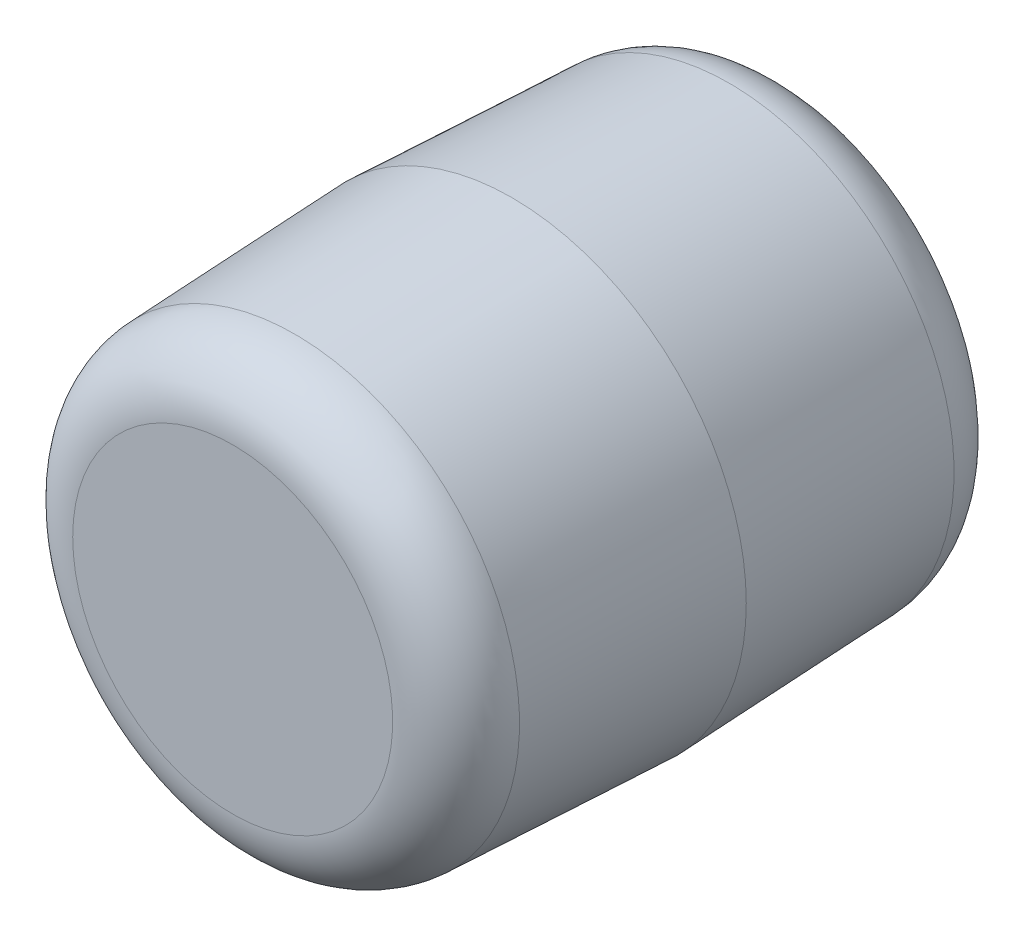
ISO-10303-21;
HEADER;
FILE_DESCRIPTION(('STEP AP214'),'2;1');
FILE_NAME('part.step','',(''),(''),'','','');
FILE_SCHEMA(('AUTOMOTIVE_DESIGN { 1 0 10303 214 1 1 1 1 }'));
ENDSEC;
DATA;
#1=APPLICATION_CONTEXT('core data for automotive mechanical design processes');
#2=APPLICATION_PROTOCOL_DEFINITION('international standard','automotive_design',2000,#1);
#3=PRODUCT_CONTEXT('',#1,'mechanical');
#4=PRODUCT('Part','Part','',(#3));
#5=PRODUCT_RELATED_PRODUCT_CATEGORY('part','',(#4));
#6=PRODUCT_DEFINITION_FORMATION('','',#4);
#7=PRODUCT_DEFINITION_CONTEXT('part definition',#1,'design');
#8=PRODUCT_DEFINITION('design','',#6,#7);
#9=PRODUCT_DEFINITION_SHAPE('','',#8);
#10=(LENGTH_UNIT() NAMED_UNIT(*) SI_UNIT(.MILLI.,.METRE.));
#11=(NAMED_UNIT(*) PLANE_ANGLE_UNIT() SI_UNIT($,.RADIAN.));
#12=(NAMED_UNIT(*) SI_UNIT($,.STERADIAN.) SOLID_ANGLE_UNIT());
#13=UNCERTAINTY_MEASURE_WITH_UNIT(LENGTH_MEASURE(1.E-05),#10,'distance_accuracy_value','');
#14=(GEOMETRIC_REPRESENTATION_CONTEXT(3) GLOBAL_UNCERTAINTY_ASSIGNED_CONTEXT((#13)) GLOBAL_UNIT_ASSIGNED_CONTEXT((#10,
#11,#12)) REPRESENTATION_CONTEXT('',''));
#15=CARTESIAN_POINT('',(0.,0.,0.));
#16=DIRECTION('',(0.,0.,1.));
#17=DIRECTION('',(1.,0.,0.));
#18=AXIS2_PLACEMENT_3D('',#15,#16,#17);
#19=CARTESIAN_POINT('',(0.,0.,189.75));
#20=DIRECTION('',(0.,0.,1.));
#21=DIRECTION('',(1.,0.,0.));
#22=AXIS2_PLACEMENT_3D('',#19,#20,#21);
#23=PLANE('',#22);
#24=CARTESIAN_POINT('',(0.,0.,189.75));
#25=DIRECTION('',(0.,0.,-1.));
#26=DIRECTION('',(-1.,0.,0.));
#27=AXIS2_PLACEMENT_3D('',#24,#25,#26);
#28=CIRCLE('',#27,110.962563910009);
#29=CARTESIAN_POINT('',(-110.962563910009,0.,189.75));
#30=VERTEX_POINT('',#29);
#31=EDGE_CURVE('E10',#30,#30,#28,.T.);
#32=ORIENTED_EDGE('',*,*,#31,.T.);
#33=EDGE_LOOP('',(#32));
#34=FACE_BOUND('',#33,.T.);
#35=ADVANCED_FACE('F35',(#34),#23,.F.);
#36=CARTESIAN_POINT('',(0.,0.,148.75));
#37=DIRECTION('',(0.,0.,-1.));
#38=DIRECTION('',(-1.,0.,0.));
#39=AXIS2_PLACEMENT_3D('',#36,#37,#38);
#40=TOROIDAL_SURFACE('',#39,110.962563910009,41.0000000000001);
#41=ORIENTED_EDGE('',*,*,#31,.F.);
#42=EDGE_LOOP('',(#41));
#43=FACE_BOUND('',#42,.T.);
#44=CARTESIAN_POINT('',(0.,0.,150.538394881979));
#45=DIRECTION('',(0.,0.,-1.));
#46=DIRECTION('',(-1.,0.,0.));
#47=AXIS2_PLACEMENT_3D('',#44,#45,#46);
#48=CIRCLE('',#47,151.923540994866);
#49=CARTESIAN_POINT('',(-151.923540994866,0.,150.538394881979));
#50=VERTEX_POINT('',#49);
#51=EDGE_CURVE('E41',#50,#50,#48,.T.);
#52=ORIENTED_EDGE('',*,*,#51,.T.);
#53=EDGE_LOOP('',(#52));
#54=FACE_BOUND('',#53,.T.);
#55=ADVANCED_FACE('F103',(#43,#54),#40,.F.);
#56=CARTESIAN_POINT('',(0.,0.,0.));
#57=DIRECTION('',(0.,0.,-1.));
#58=DIRECTION('',(-1.,0.,0.));
#59=AXIS2_PLACEMENT_3D('',#56,#57,#58);
#60=CONICAL_SURFACE('',#59,158.496189259347,0.0436332312998577);
#61=ORIENTED_EDGE('',*,*,#51,.F.);
#62=EDGE_LOOP('',(#61));
#63=FACE_BOUND('',#62,.T.);
#64=CARTESIAN_POINT('',(0.,0.,0.));
#65=DIRECTION('',(0.,0.,-1.));
#66=DIRECTION('',(-1.,0.,0.));
#67=AXIS2_PLACEMENT_3D('',#64,#65,#66);
#68=CIRCLE('',#67,158.496189259347);
#69=CARTESIAN_POINT('',(-158.496189259347,0.,0.));
#70=VERTEX_POINT('',#69);
#71=EDGE_CURVE('E45',#70,#70,#68,.T.);
#72=ORIENTED_EDGE('',*,*,#71,.T.);
#73=EDGE_LOOP('',(#72));
#74=FACE_BOUND('',#73,.T.);
#75=ADVANCED_FACE('F107',(#63,#74),#60,.F.);
#76=CARTESIAN_POINT('',(0.,0.,-150.538394881979));
#77=DIRECTION('',(0.,0.,1.));
#78=DIRECTION('',(1.,0.,0.));
#79=AXIS2_PLACEMENT_3D('',#76,#77,#78);
#80=CONICAL_SURFACE('',#79,151.923540994866,0.0436332312998544);
#81=ORIENTED_EDGE('',*,*,#71,.F.);
#82=EDGE_LOOP('',(#81));
#83=FACE_BOUND('',#82,.T.);
#84=CARTESIAN_POINT('',(0.,0.,-150.538394881979));
#85=DIRECTION('',(0.,0.,-1.));
#86=DIRECTION('',(-1.,0.,0.));
#87=AXIS2_PLACEMENT_3D('',#84,#85,#86);
#88=CIRCLE('',#87,151.923540994866);
#89=CARTESIAN_POINT('',(-151.923540994866,0.,-150.538394881979));
#90=VERTEX_POINT('',#89);
#91=EDGE_CURVE('E49',#90,#90,#88,.T.);
#92=ORIENTED_EDGE('',*,*,#91,.T.);
#93=EDGE_LOOP('',(#92));
#94=FACE_BOUND('',#93,.T.);
#95=ADVANCED_FACE('F112',(#83,#94),#80,.F.);
#96=CARTESIAN_POINT('',(0.,0.,-148.75));
#97=DIRECTION('',(0.,0.,-1.));
#98=DIRECTION('',(-1.,0.,0.));
#99=AXIS2_PLACEMENT_3D('',#96,#97,#98);
#100=TOROIDAL_SURFACE('',#99,110.96256391001,41.);
#101=ORIENTED_EDGE('',*,*,#91,.F.);
#102=EDGE_LOOP('',(#101));
#103=FACE_BOUND('',#102,.T.);
#104=CARTESIAN_POINT('',(0.,0.,-189.75));
#105=DIRECTION('',(0.,0.,-1.));
#106=DIRECTION('',(-1.,0.,0.));
#107=AXIS2_PLACEMENT_3D('',#104,#105,#106);
#108=CIRCLE('',#107,110.96256391001);
#109=CARTESIAN_POINT('',(-110.96256391001,0.,-189.75));
#110=VERTEX_POINT('',#109);
#111=EDGE_CURVE('E54',#110,#110,#108,.T.);
#112=ORIENTED_EDGE('',*,*,#111,.T.);
#113=EDGE_LOOP('',(#112));
#114=FACE_BOUND('',#113,.T.);
#115=ADVANCED_FACE('F118',(#103,#114),#100,.F.);
#116=CARTESIAN_POINT('',(110.96256391001,0.,-189.75));
#117=DIRECTION('',(0.,0.,-1.));
#118=DIRECTION('',(-1.,0.,0.));
#119=AXIS2_PLACEMENT_3D('',#116,#117,#118);
#120=PLANE('',#119);
#121=ORIENTED_EDGE('',*,*,#111,.F.);
#122=EDGE_LOOP('',(#121));
#123=FACE_BOUND('',#122,.T.);
#124=CARTESIAN_POINT('',(0.,0.,-189.75));
#125=DIRECTION('',(0.,0.,-1.));
#126=DIRECTION('',(-1.,0.,0.));
#127=AXIS2_PLACEMENT_3D('',#124,#125,#126);
#128=CIRCLE('',#127,37.);
#129=CARTESIAN_POINT('',(-37.,0.,-189.75));
#130=VERTEX_POINT('',#129);
#131=EDGE_CURVE('E57',#130,#130,#128,.T.);
#132=ORIENTED_EDGE('',*,*,#131,.T.);
#133=EDGE_LOOP('',(#132));
#134=FACE_BOUND('',#133,.T.);
#135=ADVANCED_FACE('F122',(#123,#134),#120,.F.);
#136=CARTESIAN_POINT('',(0.,0.,-205.75));
#137=DIRECTION('',(0.,0.,-1.));
#138=DIRECTION('',(-1.,0.,0.));
#139=AXIS2_PLACEMENT_3D('',#136,#137,#138);
#140=TOROIDAL_SURFACE('',#139,37.,16.);
#141=ORIENTED_EDGE('',*,*,#131,.F.);
#142=EDGE_LOOP('',(#141));
#143=FACE_BOUND('',#142,.T.);
#144=CARTESIAN_POINT('',(0.,0.,-205.75));
#145=DIRECTION('',(0.,0.,-1.));
#146=DIRECTION('',(-1.,0.,0.));
#147=AXIS2_PLACEMENT_3D('',#144,#145,#146);
#148=CIRCLE('',#147,21.);
#149=CARTESIAN_POINT('',(-21.,0.,-205.75));
#150=VERTEX_POINT('',#149);
#151=EDGE_CURVE('E60',#150,#150,#148,.T.);
#152=ORIENTED_EDGE('',*,*,#151,.T.);
#153=EDGE_LOOP('',(#152));
#154=FACE_BOUND('',#153,.T.);
#155=ADVANCED_FACE('F126',(#143,#154),#140,.T.);
#156=CARTESIAN_POINT('',(0.,0.,-288.058740367563));
#157=DIRECTION('',(0.,0.,-1.));
#158=DIRECTION('',(-1.,0.,0.));
#159=AXIS2_PLACEMENT_3D('',#156,#157,#158);
#160=CYLINDRICAL_SURFACE('',#159,21.);
#161=ORIENTED_EDGE('',*,*,#151,.F.);
#162=EDGE_LOOP('',(#161));
#163=FACE_BOUND('',#162,.T.);
#164=CARTESIAN_POINT('',(0.,0.,-213.75));
#165=DIRECTION('',(0.,0.,-1.));
#166=DIRECTION('',(-1.,0.,0.));
#167=AXIS2_PLACEMENT_3D('',#164,#165,#166);
#168=CIRCLE('',#167,21.);
#169=CARTESIAN_POINT('',(-21.,0.,-213.75));
#170=VERTEX_POINT('',#169);
#171=EDGE_CURVE('E63',#170,#170,#168,.T.);
#172=ORIENTED_EDGE('',*,*,#171,.T.);
#173=EDGE_LOOP('',(#172));
#174=FACE_BOUND('',#173,.T.);
#175=ADVANCED_FACE('F130',(#163,#174),#160,.F.);
#176=CARTESIAN_POINT('',(21.,0.,-213.75));
#177=DIRECTION('',(0.,0.,1.));
#178=DIRECTION('',(1.,0.,0.));
#179=AXIS2_PLACEMENT_3D('',#176,#177,#178);
#180=PLANE('',#179);
#181=ORIENTED_EDGE('',*,*,#171,.F.);
#182=EDGE_LOOP('',(#181));
#183=FACE_BOUND('',#182,.T.);
#184=CARTESIAN_POINT('',(0.,0.,-213.75));
#185=DIRECTION('',(0.,0.,-1.));
#186=DIRECTION('',(-1.,0.,0.));
#187=AXIS2_PLACEMENT_3D('',#184,#185,#186);
#188=CIRCLE('',#187,25.);
#189=CARTESIAN_POINT('',(-25.,0.,-213.75));
#190=VERTEX_POINT('',#189);
#191=EDGE_CURVE('E66',#190,#190,#188,.T.);
#192=ORIENTED_EDGE('',*,*,#191,.T.);
#193=EDGE_LOOP('',(#192));
#194=FACE_BOUND('',#193,.T.);
#195=ADVANCED_FACE('F134',(#183,#194),#180,.F.);
#196=CARTESIAN_POINT('',(0.,0.,-288.058740367563));
#197=DIRECTION('',(0.,0.,-1.));
#198=DIRECTION('',(-1.,0.,0.));
#199=AXIS2_PLACEMENT_3D('',#196,#197,#198);
#200=CYLINDRICAL_SURFACE('',#199,25.);
#201=ORIENTED_EDGE('',*,*,#191,.F.);
#202=EDGE_LOOP('',(#201));
#203=FACE_BOUND('',#202,.T.);
#204=CARTESIAN_POINT('',(0.,0.,-205.75));
#205=DIRECTION('',(0.,0.,-1.));
#206=DIRECTION('',(-1.,0.,0.));
#207=AXIS2_PLACEMENT_3D('',#204,#205,#206);
#208=CIRCLE('',#207,25.);
#209=CARTESIAN_POINT('',(-25.,0.,-205.75));
#210=VERTEX_POINT('',#209);
#211=EDGE_CURVE('E69',#210,#210,#208,.T.);
#212=ORIENTED_EDGE('',*,*,#211,.T.);
#213=EDGE_LOOP('',(#212));
#214=FACE_BOUND('',#213,.T.);
#215=ADVANCED_FACE('F138',(#203,#214),#200,.T.);
#216=CARTESIAN_POINT('',(0.,0.,-205.75));
#217=DIRECTION('',(0.,0.,-1.));
#218=DIRECTION('',(-1.,0.,0.));
#219=AXIS2_PLACEMENT_3D('',#216,#217,#218);
#220=TOROIDAL_SURFACE('',#219,37.,12.);
#221=ORIENTED_EDGE('',*,*,#211,.F.);
#222=EDGE_LOOP('',(#221));
#223=FACE_BOUND('',#222,.T.);
#224=CARTESIAN_POINT('',(0.,0.,-193.75));
#225=DIRECTION('',(0.,0.,-1.));
#226=DIRECTION('',(-1.,0.,0.));
#227=AXIS2_PLACEMENT_3D('',#224,#225,#226);
#228=CIRCLE('',#227,37.0000000000001);
#229=CARTESIAN_POINT('',(-37.0000000000001,0.,-193.75));
#230=VERTEX_POINT('',#229);
#231=EDGE_CURVE('E72',#230,#230,#228,.T.);
#232=ORIENTED_EDGE('',*,*,#231,.T.);
#233=EDGE_LOOP('',(#232));
#234=FACE_BOUND('',#233,.T.);
#235=ADVANCED_FACE('F142',(#223,#234),#220,.F.);
#236=CARTESIAN_POINT('',(110.96256391001,0.,-193.75));
#237=DIRECTION('',(0.,0.,1.));
#238=DIRECTION('',(1.,0.,0.));
#239=AXIS2_PLACEMENT_3D('',#236,#237,#238);
#240=PLANE('',#239);
#241=ORIENTED_EDGE('',*,*,#231,.F.);
#242=EDGE_LOOP('',(#241));
#243=FACE_BOUND('',#242,.T.);
#244=CARTESIAN_POINT('',(0.,0.,-193.75));
#245=DIRECTION('',(0.,0.,-1.));
#246=DIRECTION('',(-1.,0.,0.));
#247=AXIS2_PLACEMENT_3D('',#244,#245,#246);
#248=CIRCLE('',#247,110.96256391001);
#249=CARTESIAN_POINT('',(-110.96256391001,0.,-193.75));
#250=VERTEX_POINT('',#249);
#251=EDGE_CURVE('E75',#250,#250,#248,.T.);
#252=ORIENTED_EDGE('',*,*,#251,.T.);
#253=EDGE_LOOP('',(#252));
#254=FACE_BOUND('',#253,.T.);
#255=ADVANCED_FACE('F146',(#243,#254),#240,.F.);
#256=CARTESIAN_POINT('',(0.,0.,-148.75));
#257=DIRECTION('',(0.,0.,-1.));
#258=DIRECTION('',(-1.,0.,0.));
#259=AXIS2_PLACEMENT_3D('',#256,#257,#258);
#260=TOROIDAL_SURFACE('',#259,110.96256391001,45.);
#261=ORIENTED_EDGE('',*,*,#251,.F.);
#262=EDGE_LOOP('',(#261));
#263=FACE_BOUND('',#262,.T.);
#264=CARTESIAN_POINT('',(0.,0.,-150.71287243144));
#265=DIRECTION('',(0.,0.,-1.));
#266=DIRECTION('',(-1.,0.,0.));
#267=AXIS2_PLACEMENT_3D('',#264,#265,#266);
#268=CIRCLE('',#267,155.919733881194);
#269=CARTESIAN_POINT('',(-155.919733881194,0.,-150.71287243144));
#270=VERTEX_POINT('',#269);
#271=EDGE_CURVE('E78',#270,#270,#268,.T.);
#272=ORIENTED_EDGE('',*,*,#271,.T.);
#273=EDGE_LOOP('',(#272));
#274=FACE_BOUND('',#273,.T.);
#275=ADVANCED_FACE('F150',(#263,#274),#260,.T.);
#276=CARTESIAN_POINT('',(0.,0.,0.));
#277=DIRECTION('',(0.,0.,1.));
#278=DIRECTION('',(1.,0.,0.));
#279=AXIS2_PLACEMENT_3D('',#276,#277,#278);
#280=CONICAL_SURFACE('',#279,162.5,0.0436332312998544);
#281=ORIENTED_EDGE('',*,*,#271,.F.);
#282=EDGE_LOOP('',(#281));
#283=FACE_BOUND('',#282,.T.);
#284=CARTESIAN_POINT('',(0.,0.,0.));
#285=DIRECTION('',(0.,0.,-1.));
#286=DIRECTION('',(-1.,0.,0.));
#287=AXIS2_PLACEMENT_3D('',#284,#285,#286);
#288=CIRCLE('',#287,162.5);
#289=CARTESIAN_POINT('',(-162.5,0.,0.));
#290=VERTEX_POINT('',#289);
#291=EDGE_CURVE('E81',#290,#290,#288,.T.);
#292=ORIENTED_EDGE('',*,*,#291,.T.);
#293=EDGE_LOOP('',(#292));
#294=FACE_BOUND('',#293,.T.);
#295=ADVANCED_FACE('F154',(#283,#294),#280,.T.);
#296=CARTESIAN_POINT('',(0.,0.,150.71287243144));
#297=DIRECTION('',(0.,0.,-1.));
#298=DIRECTION('',(-1.,0.,0.));
#299=AXIS2_PLACEMENT_3D('',#296,#297,#298);
#300=CONICAL_SURFACE('',#299,155.919733881193,0.0436332312998577);
#301=ORIENTED_EDGE('',*,*,#291,.F.);
#302=EDGE_LOOP('',(#301));
#303=FACE_BOUND('',#302,.T.);
#304=CARTESIAN_POINT('',(0.,0.,150.71287243144));
#305=DIRECTION('',(0.,0.,-1.));
#306=DIRECTION('',(-1.,0.,0.));
#307=AXIS2_PLACEMENT_3D('',#304,#305,#306);
#308=CIRCLE('',#307,155.919733881193);
#309=CARTESIAN_POINT('',(-155.919733881193,0.,150.71287243144));
#310=VERTEX_POINT('',#309);
#311=EDGE_CURVE('E84',#310,#310,#308,.T.);
#312=ORIENTED_EDGE('',*,*,#311,.T.);
#313=EDGE_LOOP('',(#312));
#314=FACE_BOUND('',#313,.T.);
#315=ADVANCED_FACE('F99',(#303,#314),#300,.T.);
#316=CARTESIAN_POINT('',(0.,0.,148.75));
#317=DIRECTION('',(0.,0.,-1.));
#318=DIRECTION('',(-1.,0.,0.));
#319=AXIS2_PLACEMENT_3D('',#316,#317,#318);
#320=TOROIDAL_SURFACE('',#319,110.962563910009,45.);
#321=ORIENTED_EDGE('',*,*,#311,.F.);
#322=EDGE_LOOP('',(#321));
#323=FACE_BOUND('',#322,.T.);
#324=CARTESIAN_POINT('',(0.,0.,193.75));
#325=DIRECTION('',(0.,0.,-1.));
#326=DIRECTION('',(-1.,0.,0.));
#327=AXIS2_PLACEMENT_3D('',#324,#325,#326);
#328=CIRCLE('',#327,110.962563910009);
#329=CARTESIAN_POINT('',(-110.962563910009,0.,193.75));
#330=VERTEX_POINT('',#329);
#331=EDGE_CURVE('E87',#330,#330,#328,.T.);
#332=ORIENTED_EDGE('',*,*,#331,.T.);
#333=EDGE_LOOP('',(#332));
#334=FACE_BOUND('',#333,.T.);
#335=ADVANCED_FACE('F91',(#323,#334),#320,.T.);
#336=CARTESIAN_POINT('',(0.,0.,193.75));
#337=DIRECTION('',(0.,0.,-1.));
#338=DIRECTION('',(-1.,0.,0.));
#339=AXIS2_PLACEMENT_3D('',#336,#337,#338);
#340=PLANE('',#339);
#341=ORIENTED_EDGE('',*,*,#331,.F.);
#342=EDGE_LOOP('',(#341));
#343=FACE_BOUND('',#342,.T.);
#344=ADVANCED_FACE('F93',(#343),#340,.F.);
#345=CLOSED_SHELL('',(#35,#55,#75,#95,#115,#135,#155,#175,#195,#215,#235,#255,#275,#295,#315,
#335,#344));
#346=MANIFOLD_SOLID_BREP('B2',#345);
#347=ADVANCED_BREP_SHAPE_REPRESENTATION('',(#18,#346),#14);
#348=SHAPE_DEFINITION_REPRESENTATION(#9,#347);
ENDSEC;
END-ISO-10303-21;
